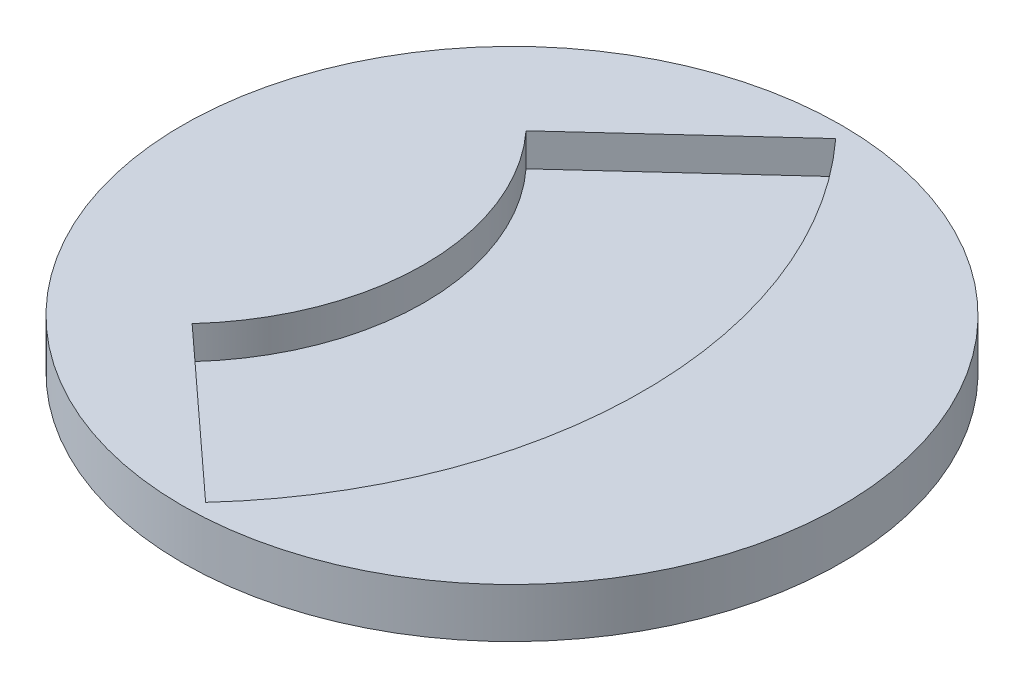
ISO-10303-21;
HEADER;
FILE_DESCRIPTION(('STEP AP214'),'2;1');
FILE_NAME('part.step','',(''),(''),'','','');
FILE_SCHEMA(('AUTOMOTIVE_DESIGN { 1 0 10303 214 1 1 1 1 }'));
ENDSEC;
DATA;
#1=APPLICATION_CONTEXT('core data for automotive mechanical design processes');
#2=APPLICATION_PROTOCOL_DEFINITION('international standard','automotive_design',2000,#1);
#3=PRODUCT_CONTEXT('',#1,'mechanical');
#4=PRODUCT('Part','Part','',(#3));
#5=PRODUCT_RELATED_PRODUCT_CATEGORY('part','',(#4));
#6=PRODUCT_DEFINITION_FORMATION('','',#4);
#7=PRODUCT_DEFINITION_CONTEXT('part definition',#1,'design');
#8=PRODUCT_DEFINITION('design','',#6,#7);
#9=PRODUCT_DEFINITION_SHAPE('','',#8);
#10=(LENGTH_UNIT() NAMED_UNIT(*) SI_UNIT(.MILLI.,.METRE.));
#11=(NAMED_UNIT(*) PLANE_ANGLE_UNIT() SI_UNIT($,.RADIAN.));
#12=(NAMED_UNIT(*) SI_UNIT($,.STERADIAN.) SOLID_ANGLE_UNIT());
#13=UNCERTAINTY_MEASURE_WITH_UNIT(LENGTH_MEASURE(1.E-05),#10,'distance_accuracy_value','');
#14=(GEOMETRIC_REPRESENTATION_CONTEXT(3) GLOBAL_UNCERTAINTY_ASSIGNED_CONTEXT((#13)) GLOBAL_UNIT_ASSIGNED_CONTEXT((#10,
#11,#12)) REPRESENTATION_CONTEXT('',''));
#15=CARTESIAN_POINT('',(0.,0.,0.));
#16=DIRECTION('',(0.,0.,1.));
#17=DIRECTION('',(1.,0.,0.));
#18=AXIS2_PLACEMENT_3D('',#15,#16,#17);
#19=CARTESIAN_POINT('',(2.9,-2.,0.));
#20=DIRECTION('',(0.,-1.,0.));
#21=DIRECTION('',(0.,0.,-1.));
#22=AXIS2_PLACEMENT_3D('',#19,#20,#21);
#23=PLANE('',#22);
#24=CARTESIAN_POINT('',(0.,-2.,0.));
#25=DIRECTION('',(0.,-1.,0.));
#26=DIRECTION('',(0.,0.,-1.));
#27=AXIS2_PLACEMENT_3D('',#24,#25,#26);
#28=CIRCLE('',#27,2.9);
#29=CARTESIAN_POINT('',(0.,-2.,-2.9));
#30=VERTEX_POINT('',#29);
#31=EDGE_CURVE('E125',#30,#30,#28,.T.);
#32=ORIENTED_EDGE('',*,*,#31,.T.);
#33=EDGE_LOOP('',(#32));
#34=FACE_BOUND('',#33,.T.);
#35=CARTESIAN_POINT('',(0.,-2.,0.));
#36=DIRECTION('',(0.,-1.,0.));
#37=DIRECTION('',(0.,0.,-1.));
#38=AXIS2_PLACEMENT_3D('',#35,#36,#37);
#39=CIRCLE('',#38,0.9);
#40=CARTESIAN_POINT('',(0.,-2.,-0.9));
#41=VERTEX_POINT('',#40);
#42=EDGE_CURVE('E11',#41,#41,#39,.T.);
#43=ORIENTED_EDGE('',*,*,#42,.F.);
#44=EDGE_LOOP('',(#43));
#45=FACE_BOUND('',#44,.T.);
#46=ADVANCED_FACE('F39',(#34,#45),#23,.T.);
#47=CARTESIAN_POINT('',(0.,-3.53918918918919,0.));
#48=DIRECTION('',(0.,-1.,0.));
#49=DIRECTION('',(0.,0.,-1.));
#50=AXIS2_PLACEMENT_3D('',#47,#48,#49);
#51=CYLINDRICAL_SURFACE('',#50,0.9);
#52=ORIENTED_EDGE('',*,*,#42,.T.);
#53=EDGE_LOOP('',(#52));
#54=FACE_BOUND('',#53,.T.);
#55=CARTESIAN_POINT('',(0.,2.,0.));
#56=DIRECTION('',(0.,-1.,0.));
#57=DIRECTION('',(0.,0.,-1.));
#58=AXIS2_PLACEMENT_3D('',#55,#56,#57);
#59=CIRCLE('',#58,0.9);
#60=CARTESIAN_POINT('',(0.,2.,-0.9));
#61=VERTEX_POINT('',#60);
#62=EDGE_CURVE('E47',#61,#61,#59,.T.);
#63=ORIENTED_EDGE('',*,*,#62,.F.);
#64=EDGE_LOOP('',(#63));
#65=FACE_BOUND('',#64,.T.);
#66=ADVANCED_FACE('F150',(#54,#65),#51,.F.);
#67=CARTESIAN_POINT('',(0.9,2.,0.));
#68=DIRECTION('',(0.,-1.,0.));
#69=DIRECTION('',(0.,0.,-1.));
#70=AXIS2_PLACEMENT_3D('',#67,#68,#69);
#71=PLANE('',#70);
#72=ORIENTED_EDGE('',*,*,#62,.T.);
#73=EDGE_LOOP('',(#72));
#74=FACE_BOUND('',#73,.T.);
#75=ADVANCED_FACE('F148',(#74),#71,.T.);
#76=CARTESIAN_POINT('',(0.,5.,0.));
#77=DIRECTION('',(0.,1.,0.));
#78=DIRECTION('',(0.,0.,1.));
#79=AXIS2_PLACEMENT_3D('',#76,#77,#78);
#80=PLANE('',#79);
#81=CARTESIAN_POINT('',(-20.3386765525098,5.,0.));
#82=DIRECTION('',(0.,1.,0.));
#83=DIRECTION('',(0.,0.,-1.));
#84=AXIS2_PLACEMENT_3D('',#81,#82,#83);
#85=CIRCLE('',#84,28.3);
#86=CARTESIAN_POINT('',(0.526272079216674,5.,19.1192028755232));
#87=VERTEX_POINT('',#86);
#88=CARTESIAN_POINT('',(0.526272079216664,5.,-19.1192028755232));
#89=VERTEX_POINT('',#88);
#90=EDGE_CURVE('E54',#87,#89,#85,.T.);
#91=ORIENTED_EDGE('',*,*,#90,.F.);
#92=DIRECTION('',(0.737277336810123,0.,0.675590207615662));
#93=VECTOR('',#92,1.);
#94=CARTESIAN_POINT('',(0.526272079216674,5.,19.1192028755232));
#95=LINE('',#94,#93);
#96=CARTESIAN_POINT('',(-9.27951650035797,5.,10.1338531142349));
#97=VERTEX_POINT('',#96);
#98=EDGE_CURVE('E109',#97,#87,#95,.T.);
#99=ORIENTED_EDGE('',*,*,#98,.F.);
#100=CARTESIAN_POINT('',(-20.3386765525098,5.,0.));
#101=DIRECTION('',(0.,-1.,0.));
#102=DIRECTION('',(0.,0.,-1.));
#103=AXIS2_PLACEMENT_3D('',#100,#101,#102);
#104=CIRCLE('',#103,15.);
#105=CARTESIAN_POINT('',(-9.27951650035797,5.,-10.1338531142349));
#106=VERTEX_POINT('',#105);
#107=EDGE_CURVE('E118',#106,#97,#104,.T.);
#108=ORIENTED_EDGE('',*,*,#107,.F.);
#109=DIRECTION('',(-0.737277336810123,0.,0.675590207615662));
#110=VECTOR('',#109,1.);
#111=CARTESIAN_POINT('',(0.526272079216665,5.,-19.1192028755232));
#112=LINE('',#111,#110);
#113=EDGE_CURVE('E89',#89,#106,#112,.T.);
#114=ORIENTED_EDGE('',*,*,#113,.F.);
#115=EDGE_LOOP('',(#91,#99,#108,#114));
#116=FACE_BOUND('',#115,.T.);
#117=CARTESIAN_POINT('',(0.,5.,0.));
#118=DIRECTION('',(0.,-1.,0.));
#119=DIRECTION('',(0.,0.,-1.));
#120=AXIS2_PLACEMENT_3D('',#117,#118,#119);
#121=CIRCLE('',#120,20.);
#122=CARTESIAN_POINT('',(0.,5.,-20.));
#123=VERTEX_POINT('',#122);
#124=EDGE_CURVE('E141',#123,#123,#121,.T.);
#125=ORIENTED_EDGE('',*,*,#124,.F.);
#126=EDGE_LOOP('',(#125));
#127=FACE_BOUND('',#126,.T.);
#128=ADVANCED_FACE('F157',(#116,#127),#80,.T.);
#129=CARTESIAN_POINT('',(0.,-3.53918918918919,0.));
#130=DIRECTION('',(0.,-1.,0.));
#131=DIRECTION('',(0.,0.,-1.));
#132=AXIS2_PLACEMENT_3D('',#129,#130,#131);
#133=CYLINDRICAL_SURFACE('',#132,20.);
#134=ORIENTED_EDGE('',*,*,#124,.T.);
#135=EDGE_LOOP('',(#134));
#136=FACE_BOUND('',#135,.T.);
#137=CARTESIAN_POINT('',(0.,2.,0.));
#138=DIRECTION('',(0.,-1.,0.));
#139=DIRECTION('',(0.,0.,-1.));
#140=AXIS2_PLACEMENT_3D('',#137,#138,#139);
#141=CIRCLE('',#140,20.);
#142=CARTESIAN_POINT('',(0.,2.,-20.));
#143=VERTEX_POINT('',#142);
#144=EDGE_CURVE('E137',#143,#143,#141,.T.);
#145=ORIENTED_EDGE('',*,*,#144,.F.);
#146=EDGE_LOOP('',(#145));
#147=FACE_BOUND('',#146,.T.);
#148=ADVANCED_FACE('F163',(#136,#147),#133,.T.);
#149=CARTESIAN_POINT('',(20.,2.,0.));
#150=DIRECTION('',(0.,-1.,0.));
#151=DIRECTION('',(0.,0.,-1.));
#152=AXIS2_PLACEMENT_3D('',#149,#150,#151);
#153=PLANE('',#152);
#154=ORIENTED_EDGE('',*,*,#144,.T.);
#155=EDGE_LOOP('',(#154));
#156=FACE_BOUND('',#155,.T.);
#157=CARTESIAN_POINT('',(0.,2.,0.));
#158=DIRECTION('',(0.,-1.,0.));
#159=DIRECTION('',(0.,0.,-1.));
#160=AXIS2_PLACEMENT_3D('',#157,#158,#159);
#161=CIRCLE('',#160,2.9);
#162=CARTESIAN_POINT('',(0.,2.,-2.9));
#163=VERTEX_POINT('',#162);
#164=EDGE_CURVE('E133',#163,#163,#161,.T.);
#165=ORIENTED_EDGE('',*,*,#164,.F.);
#166=EDGE_LOOP('',(#165));
#167=FACE_BOUND('',#166,.T.);
#168=ADVANCED_FACE('F167',(#156,#167),#153,.T.);
#169=CARTESIAN_POINT('',(0.,-3.53918918918919,0.));
#170=DIRECTION('',(0.,-1.,0.));
#171=DIRECTION('',(0.,0.,-1.));
#172=AXIS2_PLACEMENT_3D('',#169,#170,#171);
#173=CYLINDRICAL_SURFACE('',#172,2.9);
#174=ORIENTED_EDGE('',*,*,#164,.T.);
#175=EDGE_LOOP('',(#174));
#176=FACE_BOUND('',#175,.T.);
#177=ORIENTED_EDGE('',*,*,#31,.F.);
#178=EDGE_LOOP('',(#177));
#179=FACE_BOUND('',#178,.T.);
#180=ADVANCED_FACE('F171',(#176,#179),#173,.T.);
#181=CARTESIAN_POINT('',(-20.3386765525098,3.,0.));
#182=DIRECTION('',(0.,1.,0.));
#183=DIRECTION('',(0.,0.,1.));
#184=AXIS2_PLACEMENT_3D('',#181,#182,#183);
#185=CYLINDRICAL_SURFACE('',#184,28.3);
#186=ORIENTED_EDGE('',*,*,#90,.T.);
#187=DIRECTION('',(0.,1.,0.));
#188=VECTOR('',#187,1.);
#189=CARTESIAN_POINT('',(0.526272079216665,3.,-19.1192028755232));
#190=LINE('',#189,#188);
#191=CARTESIAN_POINT('',(0.526272079216665,3.,-19.1192028755232));
#192=VERTEX_POINT('',#191);
#193=EDGE_CURVE('E77',#192,#89,#190,.T.);
#194=ORIENTED_EDGE('',*,*,#193,.F.);
#195=CARTESIAN_POINT('',(-20.3386765525098,3.,0.));
#196=DIRECTION('',(0.,1.,0.));
#197=DIRECTION('',(0.,0.,-1.));
#198=AXIS2_PLACEMENT_3D('',#195,#196,#197);
#199=CIRCLE('',#198,28.3);
#200=CARTESIAN_POINT('',(0.526272079216674,3.,19.1192028755232));
#201=VERTEX_POINT('',#200);
#202=EDGE_CURVE('E105',#201,#192,#199,.T.);
#203=ORIENTED_EDGE('',*,*,#202,.F.);
#204=DIRECTION('',(0.,1.,0.));
#205=VECTOR('',#204,1.);
#206=CARTESIAN_POINT('',(0.526272079216674,3.,19.1192028755232));
#207=LINE('',#206,#205);
#208=EDGE_CURVE('E62',#201,#87,#207,.T.);
#209=ORIENTED_EDGE('',*,*,#208,.T.);
#210=EDGE_LOOP('',(#186,#194,#203,#209));
#211=FACE_BOUND('',#210,.T.);
#212=ADVANCED_FACE('F175',(#211),#185,.F.);
#213=CARTESIAN_POINT('',(0.526272079216674,3.,19.1192028755232));
#214=DIRECTION('',(-0.675590207615662,0.,0.737277336810123));
#215=DIRECTION('',(0.737277336810123,0.,0.675590207615662));
#216=AXIS2_PLACEMENT_3D('',#213,#214,#215);
#217=PLANE('',#216);
#218=ORIENTED_EDGE('',*,*,#98,.T.);
#219=ORIENTED_EDGE('',*,*,#208,.F.);
#220=DIRECTION('',(0.737277336810123,0.,0.675590207615662));
#221=VECTOR('',#220,1.);
#222=CARTESIAN_POINT('',(0.526272079216674,3.,19.1192028755232));
#223=LINE('',#222,#221);
#224=CARTESIAN_POINT('',(-9.27951650035797,3.,10.1338531142349));
#225=VERTEX_POINT('',#224);
#226=EDGE_CURVE('E102',#225,#201,#223,.T.);
#227=ORIENTED_EDGE('',*,*,#226,.F.);
#228=DIRECTION('',(0.,1.,0.));
#229=VECTOR('',#228,1.);
#230=CARTESIAN_POINT('',(-9.27951650035797,3.,10.1338531142349));
#231=LINE('',#230,#229);
#232=EDGE_CURVE('E94',#225,#97,#231,.T.);
#233=ORIENTED_EDGE('',*,*,#232,.T.);
#234=EDGE_LOOP('',(#218,#219,#227,#233));
#235=FACE_BOUND('',#234,.T.);
#236=ADVANCED_FACE('F179',(#235),#217,.F.);
#237=CARTESIAN_POINT('',(-20.3386765525098,3.,0.));
#238=DIRECTION('',(0.,1.,0.));
#239=DIRECTION('',(0.,0.,1.));
#240=AXIS2_PLACEMENT_3D('',#237,#238,#239);
#241=CYLINDRICAL_SURFACE('',#240,15.);
#242=ORIENTED_EDGE('',*,*,#107,.T.);
#243=ORIENTED_EDGE('',*,*,#232,.F.);
#244=CARTESIAN_POINT('',(-20.3386765525098,3.,0.));
#245=DIRECTION('',(0.,-1.,0.));
#246=DIRECTION('',(0.,0.,-1.));
#247=AXIS2_PLACEMENT_3D('',#244,#245,#246);
#248=CIRCLE('',#247,15.);
#249=CARTESIAN_POINT('',(-9.27951650035797,3.,-10.1338531142349));
#250=VERTEX_POINT('',#249);
#251=EDGE_CURVE('E97',#250,#225,#248,.T.);
#252=ORIENTED_EDGE('',*,*,#251,.F.);
#253=DIRECTION('',(0.,1.,0.));
#254=VECTOR('',#253,1.);
#255=CARTESIAN_POINT('',(-9.27951650035797,3.,-10.1338531142349));
#256=LINE('',#255,#254);
#257=EDGE_CURVE('E82',#250,#106,#256,.T.);
#258=ORIENTED_EDGE('',*,*,#257,.T.);
#259=EDGE_LOOP('',(#242,#243,#252,#258));
#260=FACE_BOUND('',#259,.T.);
#261=ADVANCED_FACE('F98',(#260),#241,.T.);
#262=CARTESIAN_POINT('',(0.526272079216665,3.,-19.1192028755232));
#263=DIRECTION('',(-0.675590207615662,0.,-0.737277336810122));
#264=DIRECTION('',(-0.737277336810123,0.,0.675590207615662));
#265=AXIS2_PLACEMENT_3D('',#262,#263,#264);
#266=PLANE('',#265);
#267=ORIENTED_EDGE('',*,*,#113,.T.);
#268=ORIENTED_EDGE('',*,*,#257,.F.);
#269=DIRECTION('',(-0.737277336810123,0.,0.675590207615662));
#270=VECTOR('',#269,1.);
#271=CARTESIAN_POINT('',(0.526272079216665,3.,-19.1192028755232));
#272=LINE('',#271,#270);
#273=EDGE_CURVE('E86',#192,#250,#272,.T.);
#274=ORIENTED_EDGE('',*,*,#273,.F.);
#275=ORIENTED_EDGE('',*,*,#193,.T.);
#276=EDGE_LOOP('',(#267,#268,#274,#275));
#277=FACE_BOUND('',#276,.T.);
#278=ADVANCED_FACE('F84',(#277),#266,.F.);
#279=CARTESIAN_POINT('',(-20.3386765525098,3.,0.));
#280=DIRECTION('',(0.,-1.,0.));
#281=DIRECTION('',(0.,0.,-1.));
#282=AXIS2_PLACEMENT_3D('',#279,#280,#281);
#283=PLANE('',#282);
#284=ORIENTED_EDGE('',*,*,#202,.T.);
#285=ORIENTED_EDGE('',*,*,#273,.T.);
#286=ORIENTED_EDGE('',*,*,#251,.T.);
#287=ORIENTED_EDGE('',*,*,#226,.T.);
#288=EDGE_LOOP('',(#284,#285,#286,#287));
#289=FACE_BOUND('',#288,.T.);
#290=ADVANCED_FACE('F104',(#289),#283,.F.);
#291=CLOSED_SHELL('',(#46,#66,#75,#128,#148,#168,#180,#212,#236,#261,#278,#290));
#292=MANIFOLD_SOLID_BREP('B2',#291);
#293=ADVANCED_BREP_SHAPE_REPRESENTATION('',(#18,#292),#14);
#294=SHAPE_DEFINITION_REPRESENTATION(#9,#293);
ENDSEC;
END-ISO-10303-21;
